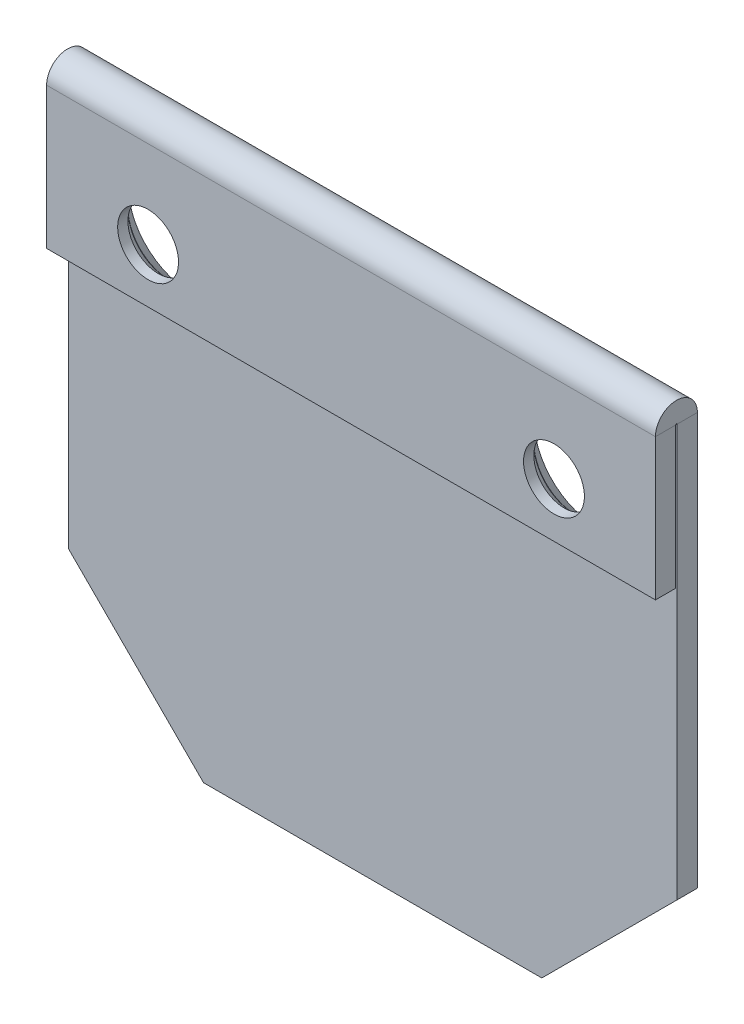
ISO-10303-21;
HEADER;
FILE_DESCRIPTION(('STEP AP214'),'2;1');
FILE_NAME('part.step','',(''),(''),'','','');
FILE_SCHEMA(('AUTOMOTIVE_DESIGN { 1 0 10303 214 1 1 1 1 }'));
ENDSEC;
DATA;
#1=APPLICATION_CONTEXT('core data for automotive mechanical design processes');
#2=APPLICATION_PROTOCOL_DEFINITION('international standard','automotive_design',2000,#1);
#3=PRODUCT_CONTEXT('',#1,'mechanical');
#4=PRODUCT('Part','Part','',(#3));
#5=PRODUCT_RELATED_PRODUCT_CATEGORY('part','',(#4));
#6=PRODUCT_DEFINITION_FORMATION('','',#4);
#7=PRODUCT_DEFINITION_CONTEXT('part definition',#1,'design');
#8=PRODUCT_DEFINITION('design','',#6,#7);
#9=PRODUCT_DEFINITION_SHAPE('','',#8);
#10=(LENGTH_UNIT() NAMED_UNIT(*) SI_UNIT(.MILLI.,.METRE.));
#11=(NAMED_UNIT(*) PLANE_ANGLE_UNIT() SI_UNIT($,.RADIAN.));
#12=(NAMED_UNIT(*) SI_UNIT($,.STERADIAN.) SOLID_ANGLE_UNIT());
#13=UNCERTAINTY_MEASURE_WITH_UNIT(LENGTH_MEASURE(1.E-05),#10,'distance_accuracy_value','');
#14=(GEOMETRIC_REPRESENTATION_CONTEXT(3) GLOBAL_UNCERTAINTY_ASSIGNED_CONTEXT((#13)) GLOBAL_UNIT_ASSIGNED_CONTEXT((#10,
#11,#12)) REPRESENTATION_CONTEXT('',''));
#15=CARTESIAN_POINT('',(0.,0.,0.));
#16=DIRECTION('',(0.,0.,1.));
#17=DIRECTION('',(1.,0.,0.));
#18=AXIS2_PLACEMENT_3D('',#15,#16,#17);
#19=CARTESIAN_POINT('',(-22.5,-21.,-1.5));
#20=DIRECTION('',(-1.,0.,0.));
#21=DIRECTION('',(0.,0.,1.));
#22=AXIS2_PLACEMENT_3D('',#19,#20,#21);
#23=PLANE('',#22);
#24=DIRECTION('',(0.,-1.,0.));
#25=VECTOR('',#24,1.);
#26=CARTESIAN_POINT('',(-22.5,-21.,-1.5));
#27=LINE('',#26,#25);
#28=CARTESIAN_POINT('',(-22.5,19.45,-1.5));
#29=VERTEX_POINT('',#28);
#30=CARTESIAN_POINT('',(-22.5,-11.,-1.5));
#31=VERTEX_POINT('',#30);
#32=EDGE_CURVE('E122',#29,#31,#27,.T.);
#33=ORIENTED_EDGE('',*,*,#32,.T.);
#34=DIRECTION('',(0.,0.,1.));
#35=VECTOR('',#34,1.);
#36=CARTESIAN_POINT('',(-22.5,-11.,-1.5));
#37=LINE('',#36,#35);
#38=CARTESIAN_POINT('',(-22.5,-11.,0.));
#39=VERTEX_POINT('',#38);
#40=EDGE_CURVE('E218',#31,#39,#37,.T.);
#41=ORIENTED_EDGE('',*,*,#40,.T.);
#42=DIRECTION('',(0.,-1.,0.));
#43=VECTOR('',#42,1.);
#44=CARTESIAN_POINT('',(-22.5,-21.,0.));
#45=LINE('',#44,#43);
#46=CARTESIAN_POINT('',(-22.5,19.45,0.));
#47=VERTEX_POINT('',#46);
#48=EDGE_CURVE('E199',#47,#39,#45,.T.);
#49=ORIENTED_EDGE('',*,*,#48,.F.);
#50=DIRECTION('',(0.,0.,-1.));
#51=VECTOR('',#50,1.);
#52=CARTESIAN_POINT('',(-22.5,19.45,0.));
#53=LINE('',#52,#51);
#54=EDGE_CURVE('E135',#47,#29,#53,.T.);
#55=ORIENTED_EDGE('',*,*,#54,.T.);
#56=EDGE_LOOP('',(#33,#41,#49,#55));
#57=FACE_BOUND('',#56,.T.);
#58=ADVANCED_FACE('F36',(#57),#23,.T.);
#59=CARTESIAN_POINT('',(22.5,-21.,-1.5));
#60=DIRECTION('',(1.,0.,0.));
#61=DIRECTION('',(0.,0.,-1.));
#62=AXIS2_PLACEMENT_3D('',#59,#60,#61);
#63=PLANE('',#62);
#64=DIRECTION('',(0.,1.,0.));
#65=VECTOR('',#64,1.);
#66=CARTESIAN_POINT('',(22.5,-21.,0.));
#67=LINE('',#66,#65);
#68=CARTESIAN_POINT('',(22.5,-11.,0.));
#69=VERTEX_POINT('',#68);
#70=CARTESIAN_POINT('',(22.5,19.45,0.));
#71=VERTEX_POINT('',#70);
#72=EDGE_CURVE('E192',#69,#71,#67,.T.);
#73=ORIENTED_EDGE('',*,*,#72,.F.);
#74=DIRECTION('',(0.,0.,-1.));
#75=VECTOR('',#74,1.);
#76=CARTESIAN_POINT('',(22.5,-11.,-1.5));
#77=LINE('',#76,#75);
#78=CARTESIAN_POINT('',(22.5,-11.,-1.5));
#79=VERTEX_POINT('',#78);
#80=EDGE_CURVE('E117',#69,#79,#77,.T.);
#81=ORIENTED_EDGE('',*,*,#80,.T.);
#82=DIRECTION('',(0.,1.,0.));
#83=VECTOR('',#82,1.);
#84=CARTESIAN_POINT('',(22.5,-21.,-1.5));
#85=LINE('',#84,#83);
#86=CARTESIAN_POINT('',(22.5,19.45,-1.5));
#87=VERTEX_POINT('',#86);
#88=EDGE_CURVE('E111',#79,#87,#85,.T.);
#89=ORIENTED_EDGE('',*,*,#88,.T.);
#90=DIRECTION('',(0.,0.,-1.));
#91=VECTOR('',#90,1.);
#92=CARTESIAN_POINT('',(22.5,19.45,0.));
#93=LINE('',#92,#91);
#94=EDGE_CURVE('E115',#71,#87,#93,.T.);
#95=ORIENTED_EDGE('',*,*,#94,.F.);
#96=EDGE_LOOP('',(#73,#81,#89,#95));
#97=FACE_BOUND('',#96,.T.);
#98=ADVANCED_FACE('F114',(#97),#63,.T.);
#99=CARTESIAN_POINT('',(-22.5,-21.,-1.5));
#100=DIRECTION('',(0.,-1.,0.));
#101=DIRECTION('',(0.,0.,-1.));
#102=AXIS2_PLACEMENT_3D('',#99,#100,#101);
#103=PLANE('',#102);
#104=DIRECTION('',(1.,0.,0.));
#105=VECTOR('',#104,1.);
#106=CARTESIAN_POINT('',(-22.5,-21.,0.));
#107=LINE('',#106,#105);
#108=CARTESIAN_POINT('',(-12.5,-21.,0.));
#109=VERTEX_POINT('',#108);
#110=CARTESIAN_POINT('',(12.5,-21.,0.));
#111=VERTEX_POINT('',#110);
#112=EDGE_CURVE('E123',#109,#111,#107,.T.);
#113=ORIENTED_EDGE('',*,*,#112,.F.);
#114=DIRECTION('',(0.,0.,-1.));
#115=VECTOR('',#114,1.);
#116=CARTESIAN_POINT('',(-12.5,-21.,-1.5));
#117=LINE('',#116,#115);
#118=CARTESIAN_POINT('',(-12.5,-21.,-1.5));
#119=VERTEX_POINT('',#118);
#120=EDGE_CURVE('E44',#109,#119,#117,.T.);
#121=ORIENTED_EDGE('',*,*,#120,.T.);
#122=DIRECTION('',(1.,0.,0.));
#123=VECTOR('',#122,1.);
#124=CARTESIAN_POINT('',(-22.5,-21.,-1.5));
#125=LINE('',#124,#123);
#126=CARTESIAN_POINT('',(12.5,-21.,-1.5));
#127=VERTEX_POINT('',#126);
#128=EDGE_CURVE('E195',#119,#127,#125,.T.);
#129=ORIENTED_EDGE('',*,*,#128,.T.);
#130=DIRECTION('',(0.,0.,1.));
#131=VECTOR('',#130,1.);
#132=CARTESIAN_POINT('',(12.5,-21.,-1.5));
#133=LINE('',#132,#131);
#134=EDGE_CURVE('E197',#127,#111,#133,.T.);
#135=ORIENTED_EDGE('',*,*,#134,.T.);
#136=EDGE_LOOP('',(#113,#121,#129,#135));
#137=FACE_BOUND('',#136,.T.);
#138=ADVANCED_FACE('F266',(#137),#103,.T.);
#139=CARTESIAN_POINT('',(0.,0.,-1.5));
#140=DIRECTION('',(0.,0.,-1.));
#141=DIRECTION('',(-1.,0.,0.));
#142=AXIS2_PLACEMENT_3D('',#139,#140,#141);
#143=PLANE('',#142);
#144=CARTESIAN_POINT('',(15.,13.,-1.5));
#145=DIRECTION('',(0.,0.,-1.));
#146=DIRECTION('',(-1.,0.,0.));
#147=AXIS2_PLACEMENT_3D('',#144,#145,#146);
#148=CIRCLE('',#147,4.59);
#149=CARTESIAN_POINT('',(10.41,13.,-1.5));
#150=VERTEX_POINT('',#149);
#151=EDGE_CURVE('E296',#150,#150,#148,.T.);
#152=ORIENTED_EDGE('',*,*,#151,.F.);
#153=EDGE_LOOP('',(#152));
#154=FACE_BOUND('',#153,.T.);
#155=CARTESIAN_POINT('',(-15.,13.,-1.5));
#156=DIRECTION('',(0.,0.,-1.));
#157=DIRECTION('',(-1.,0.,0.));
#158=AXIS2_PLACEMENT_3D('',#155,#156,#157);
#159=CIRCLE('',#158,4.59);
#160=CARTESIAN_POINT('',(-19.59,13.,-1.5));
#161=VERTEX_POINT('',#160);
#162=EDGE_CURVE('E299',#161,#161,#159,.T.);
#163=ORIENTED_EDGE('',*,*,#162,.F.);
#164=EDGE_LOOP('',(#163));
#165=FACE_BOUND('',#164,.T.);
#166=ORIENTED_EDGE('',*,*,#128,.F.);
#167=DIRECTION('',(0.707106781186548,-0.707106781186548,0.));
#168=VECTOR('',#167,1.);
#169=CARTESIAN_POINT('',(-16.75,-16.75,-1.5));
#170=LINE('',#169,#168);
#171=EDGE_CURVE('E11',#119,#31,#170,.F.);
#172=ORIENTED_EDGE('',*,*,#171,.T.);
#173=ORIENTED_EDGE('',*,*,#32,.F.);
#174=DIRECTION('',(-1.,0.,0.));
#175=VECTOR('',#174,1.);
#176=CARTESIAN_POINT('',(-22.5,19.45,-1.5));
#177=LINE('',#176,#175);
#178=EDGE_CURVE('E141',#29,#87,#177,.F.);
#179=ORIENTED_EDGE('',*,*,#178,.T.);
#180=ORIENTED_EDGE('',*,*,#88,.F.);
#181=DIRECTION('',(0.707106781186548,0.707106781186547,0.));
#182=VECTOR('',#181,1.);
#183=CARTESIAN_POINT('',(16.75,-16.75,-1.5));
#184=LINE('',#183,#182);
#185=EDGE_CURVE('E216',#79,#127,#184,.F.);
#186=ORIENTED_EDGE('',*,*,#185,.T.);
#187=EDGE_LOOP('',(#166,#172,#173,#179,#180,#186));
#188=FACE_BOUND('',#187,.T.);
#189=ADVANCED_FACE('F146',(#154,#165,#188),#143,.T.);
#190=CARTESIAN_POINT('',(0.,0.,0.));
#191=DIRECTION('',(0.,0.,-1.));
#192=DIRECTION('',(-1.,0.,0.));
#193=AXIS2_PLACEMENT_3D('',#190,#191,#192);
#194=PLANE('',#193);
#195=CARTESIAN_POINT('',(15.,13.,0.));
#196=DIRECTION('',(0.,0.,-1.));
#197=DIRECTION('',(-1.,0.,0.));
#198=AXIS2_PLACEMENT_3D('',#195,#196,#197);
#199=CIRCLE('',#198,3.08999999999999);
#200=CARTESIAN_POINT('',(11.91,13.,0.));
#201=VERTEX_POINT('',#200);
#202=EDGE_CURVE('E209',#201,#201,#199,.T.);
#203=ORIENTED_EDGE('',*,*,#202,.T.);
#204=EDGE_LOOP('',(#203));
#205=FACE_BOUND('',#204,.T.);
#206=CARTESIAN_POINT('',(-15.,13.,0.));
#207=DIRECTION('',(0.,0.,-1.));
#208=DIRECTION('',(-1.,0.,0.));
#209=AXIS2_PLACEMENT_3D('',#206,#207,#208);
#210=CIRCLE('',#209,3.08999999999999);
#211=CARTESIAN_POINT('',(-18.09,13.,0.));
#212=VERTEX_POINT('',#211);
#213=EDGE_CURVE('E152',#212,#212,#210,.T.);
#214=ORIENTED_EDGE('',*,*,#213,.T.);
#215=EDGE_LOOP('',(#214));
#216=FACE_BOUND('',#215,.T.);
#217=ORIENTED_EDGE('',*,*,#48,.T.);
#218=DIRECTION('',(-0.707106781186548,0.707106781186548,0.));
#219=VECTOR('',#218,1.);
#220=CARTESIAN_POINT('',(-22.5,-11.,0.));
#221=LINE('',#220,#219);
#222=EDGE_CURVE('E58',#39,#109,#221,.F.);
#223=ORIENTED_EDGE('',*,*,#222,.T.);
#224=ORIENTED_EDGE('',*,*,#112,.T.);
#225=DIRECTION('',(-0.707106781186548,-0.707106781186547,0.));
#226=VECTOR('',#225,1.);
#227=CARTESIAN_POINT('',(12.5,-21.,0.));
#228=LINE('',#227,#226);
#229=EDGE_CURVE('E213',#111,#69,#228,.F.);
#230=ORIENTED_EDGE('',*,*,#229,.T.);
#231=ORIENTED_EDGE('',*,*,#72,.T.);
#232=DIRECTION('',(-1.,0.,0.));
#233=VECTOR('',#232,1.);
#234=CARTESIAN_POINT('',(-22.5,19.45,0.));
#235=LINE('',#234,#233);
#236=EDGE_CURVE('E156',#47,#71,#235,.F.);
#237=ORIENTED_EDGE('',*,*,#236,.F.);
#238=EDGE_LOOP('',(#217,#223,#224,#230,#231,#237));
#239=FACE_BOUND('',#238,.T.);
#240=ADVANCED_FACE('F227',(#205,#216,#239),#194,.F.);
#241=CARTESIAN_POINT('',(-22.5,14.225,1.6));
#242=DIRECTION('',(1.,0.,0.));
#243=DIRECTION('',(0.,1.,0.));
#244=AXIS2_PLACEMENT_3D('',#241,#242,#243);
#245=PLANE('',#244);
#246=DIRECTION('',(0.,0.,1.));
#247=VECTOR('',#246,1.);
#248=CARTESIAN_POINT('',(-22.5,19.45,1.6));
#249=LINE('',#248,#247);
#250=CARTESIAN_POINT('',(-22.5,19.45,0.1));
#251=VERTEX_POINT('',#250);
#252=CARTESIAN_POINT('',(-22.5,19.45,1.6));
#253=VERTEX_POINT('',#252);
#254=EDGE_CURVE('E186',#251,#253,#249,.T.);
#255=ORIENTED_EDGE('',*,*,#254,.F.);
#256=DIRECTION('',(0.,1.,0.));
#257=VECTOR('',#256,1.);
#258=CARTESIAN_POINT('',(-22.5,14.225,0.1));
#259=LINE('',#258,#257);
#260=CARTESIAN_POINT('',(-22.5,9.,0.1));
#261=VERTEX_POINT('',#260);
#262=EDGE_CURVE('E177',#261,#251,#259,.T.);
#263=ORIENTED_EDGE('',*,*,#262,.F.);
#264=DIRECTION('',(0.,0.,1.));
#265=VECTOR('',#264,1.);
#266=CARTESIAN_POINT('',(-22.5,9.,1.6));
#267=LINE('',#266,#265);
#268=CARTESIAN_POINT('',(-22.5,9.,1.6));
#269=VERTEX_POINT('',#268);
#270=EDGE_CURVE('E184',#261,#269,#267,.T.);
#271=ORIENTED_EDGE('',*,*,#270,.T.);
#272=DIRECTION('',(0.,1.,0.));
#273=VECTOR('',#272,1.);
#274=CARTESIAN_POINT('',(-22.5,14.225,1.6));
#275=LINE('',#274,#273);
#276=EDGE_CURVE('E167',#269,#253,#275,.T.);
#277=ORIENTED_EDGE('',*,*,#276,.T.);
#278=EDGE_LOOP('',(#255,#263,#271,#277));
#279=FACE_BOUND('',#278,.T.);
#280=ADVANCED_FACE('F237',(#279),#245,.F.);
#281=CARTESIAN_POINT('',(0.,9.,1.6));
#282=DIRECTION('',(0.,1.,0.));
#283=DIRECTION('',(-1.,0.,0.));
#284=AXIS2_PLACEMENT_3D('',#281,#282,#283);
#285=PLANE('',#284);
#286=ORIENTED_EDGE('',*,*,#270,.F.);
#287=DIRECTION('',(1.,0.,0.));
#288=VECTOR('',#287,1.);
#289=CARTESIAN_POINT('',(0.,9.,0.1));
#290=LINE('',#289,#288);
#291=CARTESIAN_POINT('',(22.5,9.,0.1));
#292=VERTEX_POINT('',#291);
#293=EDGE_CURVE('E174',#292,#261,#290,.F.);
#294=ORIENTED_EDGE('',*,*,#293,.F.);
#295=DIRECTION('',(0.,0.,1.));
#296=VECTOR('',#295,1.);
#297=CARTESIAN_POINT('',(22.5,9.,1.6));
#298=LINE('',#297,#296);
#299=CARTESIAN_POINT('',(22.5,9.,1.6));
#300=VERTEX_POINT('',#299);
#301=EDGE_CURVE('E166',#292,#300,#298,.T.);
#302=ORIENTED_EDGE('',*,*,#301,.T.);
#303=DIRECTION('',(-1.,0.,0.));
#304=VECTOR('',#303,1.);
#305=CARTESIAN_POINT('',(0.,9.,1.6));
#306=LINE('',#305,#304);
#307=EDGE_CURVE('E163',#300,#269,#306,.T.);
#308=ORIENTED_EDGE('',*,*,#307,.T.);
#309=EDGE_LOOP('',(#286,#294,#302,#308));
#310=FACE_BOUND('',#309,.T.);
#311=ADVANCED_FACE('F244',(#310),#285,.F.);
#312=CARTESIAN_POINT('',(22.5,14.225,1.6));
#313=DIRECTION('',(-1.,0.,0.));
#314=DIRECTION('',(0.,-1.,0.));
#315=AXIS2_PLACEMENT_3D('',#312,#313,#314);
#316=PLANE('',#315);
#317=DIRECTION('',(0.,1.,0.));
#318=VECTOR('',#317,1.);
#319=CARTESIAN_POINT('',(22.5,14.225,0.1));
#320=LINE('',#319,#318);
#321=CARTESIAN_POINT('',(22.5,19.45,0.1));
#322=VERTEX_POINT('',#321);
#323=EDGE_CURVE('E134',#322,#292,#320,.F.);
#324=ORIENTED_EDGE('',*,*,#323,.F.);
#325=DIRECTION('',(0.,0.,1.));
#326=VECTOR('',#325,1.);
#327=CARTESIAN_POINT('',(22.5,19.45,1.6));
#328=LINE('',#327,#326);
#329=CARTESIAN_POINT('',(22.5,19.45,1.6));
#330=VERTEX_POINT('',#329);
#331=EDGE_CURVE('E189',#322,#330,#328,.T.);
#332=ORIENTED_EDGE('',*,*,#331,.T.);
#333=DIRECTION('',(0.,-1.,0.));
#334=VECTOR('',#333,1.);
#335=CARTESIAN_POINT('',(22.5,14.225,1.6));
#336=LINE('',#335,#334);
#337=EDGE_CURVE('E171',#330,#300,#336,.T.);
#338=ORIENTED_EDGE('',*,*,#337,.T.);
#339=ORIENTED_EDGE('',*,*,#301,.F.);
#340=EDGE_LOOP('',(#324,#332,#338,#339));
#341=FACE_BOUND('',#340,.T.);
#342=ADVANCED_FACE('F249',(#341),#316,.F.);
#343=CARTESIAN_POINT('',(0.,14.225,1.6));
#344=DIRECTION('',(0.,0.,1.));
#345=DIRECTION('',(1.,0.,0.));
#346=AXIS2_PLACEMENT_3D('',#343,#344,#345);
#347=PLANE('',#346);
#348=CARTESIAN_POINT('',(15.,13.,1.6));
#349=DIRECTION('',(0.,0.,-1.));
#350=DIRECTION('',(-1.,0.,0.));
#351=AXIS2_PLACEMENT_3D('',#348,#349,#350);
#352=CIRCLE('',#351,2.25);
#353=CARTESIAN_POINT('',(12.75,13.,1.6));
#354=VERTEX_POINT('',#353);
#355=EDGE_CURVE('E210',#354,#354,#352,.T.);
#356=ORIENTED_EDGE('',*,*,#355,.T.);
#357=EDGE_LOOP('',(#356));
#358=FACE_BOUND('',#357,.T.);
#359=CARTESIAN_POINT('',(-15.,13.,1.6));
#360=DIRECTION('',(0.,0.,-1.));
#361=DIRECTION('',(-1.,0.,0.));
#362=AXIS2_PLACEMENT_3D('',#359,#360,#361);
#363=CIRCLE('',#362,2.25);
#364=CARTESIAN_POINT('',(-17.25,13.,1.6));
#365=VERTEX_POINT('',#364);
#366=EDGE_CURVE('E205',#365,#365,#363,.T.);
#367=ORIENTED_EDGE('',*,*,#366,.T.);
#368=EDGE_LOOP('',(#367));
#369=FACE_BOUND('',#368,.T.);
#370=ORIENTED_EDGE('',*,*,#307,.F.);
#371=ORIENTED_EDGE('',*,*,#337,.F.);
#372=DIRECTION('',(1.,0.,0.));
#373=VECTOR('',#372,1.);
#374=CARTESIAN_POINT('',(0.,19.45,1.6));
#375=LINE('',#374,#373);
#376=EDGE_CURVE('E143',#253,#330,#375,.T.);
#377=ORIENTED_EDGE('',*,*,#376,.F.);
#378=ORIENTED_EDGE('',*,*,#276,.F.);
#379=EDGE_LOOP('',(#370,#371,#377,#378));
#380=FACE_BOUND('',#379,.T.);
#381=ADVANCED_FACE('F247',(#358,#369,#380),#347,.T.);
#382=CARTESIAN_POINT('',(0.,14.225,0.1));
#383=DIRECTION('',(0.,0.,1.));
#384=DIRECTION('',(1.,0.,0.));
#385=AXIS2_PLACEMENT_3D('',#382,#383,#384);
#386=PLANE('',#385);
#387=CARTESIAN_POINT('',(15.,13.,0.0999999999999998));
#388=DIRECTION('',(0.,0.,1.));
#389=DIRECTION('',(1.,0.,0.));
#390=AXIS2_PLACEMENT_3D('',#387,#388,#389);
#391=CIRCLE('',#390,2.98999999999999);
#392=CARTESIAN_POINT('',(17.99,13.,0.0999999999999998));
#393=VERTEX_POINT('',#392);
#394=EDGE_CURVE('E206',#393,#393,#391,.T.);
#395=ORIENTED_EDGE('',*,*,#394,.T.);
#396=EDGE_LOOP('',(#395));
#397=FACE_BOUND('',#396,.T.);
#398=CARTESIAN_POINT('',(-15.,13.,0.0999999999999998));
#399=DIRECTION('',(0.,0.,1.));
#400=DIRECTION('',(1.,0.,0.));
#401=AXIS2_PLACEMENT_3D('',#398,#399,#400);
#402=CIRCLE('',#401,2.98999999999999);
#403=CARTESIAN_POINT('',(-12.01,13.,0.0999999999999998));
#404=VERTEX_POINT('',#403);
#405=EDGE_CURVE('E202',#404,#404,#402,.T.);
#406=ORIENTED_EDGE('',*,*,#405,.T.);
#407=EDGE_LOOP('',(#406));
#408=FACE_BOUND('',#407,.T.);
#409=ORIENTED_EDGE('',*,*,#293,.T.);
#410=ORIENTED_EDGE('',*,*,#262,.T.);
#411=DIRECTION('',(1.,0.,0.));
#412=VECTOR('',#411,1.);
#413=CARTESIAN_POINT('',(0.,19.45,0.1));
#414=LINE('',#413,#412);
#415=EDGE_CURVE('E180',#251,#322,#414,.T.);
#416=ORIENTED_EDGE('',*,*,#415,.T.);
#417=ORIENTED_EDGE('',*,*,#323,.T.);
#418=EDGE_LOOP('',(#409,#410,#416,#417));
#419=FACE_BOUND('',#418,.T.);
#420=ADVANCED_FACE('F240',(#397,#408,#419),#386,.F.);
#421=CARTESIAN_POINT('',(22.5,19.45,0.0500000000000001));
#422=DIRECTION('',(1.,0.,0.));
#423=DIRECTION('',(0.,0.,-1.));
#424=AXIS2_PLACEMENT_3D('',#421,#422,#423);
#425=PLANE('',#424);
#426=ORIENTED_EDGE('',*,*,#331,.F.);
#427=CARTESIAN_POINT('',(22.5,19.45,0.0500000000000001));
#428=DIRECTION('',(-1.,0.,0.));
#429=DIRECTION('',(0.,0.,1.));
#430=AXIS2_PLACEMENT_3D('',#427,#428,#429);
#431=CIRCLE('',#430,0.0500000000000001);
#432=EDGE_CURVE('E133',#71,#322,#431,.F.);
#433=ORIENTED_EDGE('',*,*,#432,.F.);
#434=ORIENTED_EDGE('',*,*,#94,.T.);
#435=CARTESIAN_POINT('',(22.5,19.45,0.0500000000000001));
#436=DIRECTION('',(-1.,0.,0.));
#437=DIRECTION('',(0.,0.,1.));
#438=AXIS2_PLACEMENT_3D('',#435,#436,#437);
#439=CIRCLE('',#438,1.55);
#440=EDGE_CURVE('E131',#87,#330,#439,.F.);
#441=ORIENTED_EDGE('',*,*,#440,.T.);
#442=EDGE_LOOP('',(#426,#433,#434,#441));
#443=FACE_BOUND('',#442,.T.);
#444=ADVANCED_FACE('F130',(#443),#425,.T.);
#445=CARTESIAN_POINT('',(-22.5,19.45,0.0500000000000001));
#446=DIRECTION('',(1.,0.,0.));
#447=DIRECTION('',(0.,0.,-1.));
#448=AXIS2_PLACEMENT_3D('',#445,#446,#447);
#449=PLANE('',#448);
#450=CARTESIAN_POINT('',(-22.5,19.45,0.0500000000000001));
#451=DIRECTION('',(-1.,0.,0.));
#452=DIRECTION('',(0.,0.,1.));
#453=AXIS2_PLACEMENT_3D('',#450,#451,#452);
#454=CIRCLE('',#453,0.0500000000000001);
#455=EDGE_CURVE('E159',#251,#47,#454,.T.);
#456=ORIENTED_EDGE('',*,*,#455,.F.);
#457=ORIENTED_EDGE('',*,*,#254,.T.);
#458=CARTESIAN_POINT('',(-22.5,19.45,0.0500000000000001));
#459=DIRECTION('',(-1.,0.,0.));
#460=DIRECTION('',(0.,0.,1.));
#461=AXIS2_PLACEMENT_3D('',#458,#459,#460);
#462=CIRCLE('',#461,1.55);
#463=EDGE_CURVE('E148',#253,#29,#462,.T.);
#464=ORIENTED_EDGE('',*,*,#463,.T.);
#465=ORIENTED_EDGE('',*,*,#54,.F.);
#466=EDGE_LOOP('',(#456,#457,#464,#465));
#467=FACE_BOUND('',#466,.T.);
#468=ADVANCED_FACE('F234',(#467),#449,.F.);
#469=CARTESIAN_POINT('',(-22.5,19.45,0.0500000000000001));
#470=DIRECTION('',(-1.,0.,0.));
#471=DIRECTION('',(0.,0.,1.));
#472=AXIS2_PLACEMENT_3D('',#469,#470,#471);
#473=CYLINDRICAL_SURFACE('',#472,1.55);
#474=ORIENTED_EDGE('',*,*,#178,.F.);
#475=ORIENTED_EDGE('',*,*,#463,.F.);
#476=ORIENTED_EDGE('',*,*,#376,.T.);
#477=ORIENTED_EDGE('',*,*,#440,.F.);
#478=EDGE_LOOP('',(#474,#475,#476,#477));
#479=FACE_BOUND('',#478,.T.);
#480=ADVANCED_FACE('F139',(#479),#473,.T.);
#481=CARTESIAN_POINT('',(-22.5,19.45,0.0500000000000001));
#482=DIRECTION('',(-1.,0.,0.));
#483=DIRECTION('',(0.,0.,1.));
#484=AXIS2_PLACEMENT_3D('',#481,#482,#483);
#485=CYLINDRICAL_SURFACE('',#484,0.0500000000000001);
#486=ORIENTED_EDGE('',*,*,#236,.T.);
#487=ORIENTED_EDGE('',*,*,#432,.T.);
#488=ORIENTED_EDGE('',*,*,#415,.F.);
#489=ORIENTED_EDGE('',*,*,#455,.T.);
#490=EDGE_LOOP('',(#486,#487,#488,#489));
#491=FACE_BOUND('',#490,.T.);
#492=ADVANCED_FACE('F229',(#491),#485,.F.);
#493=CARTESIAN_POINT('',(-15.,13.,-1.5));
#494=DIRECTION('',(0.,0.,-1.));
#495=DIRECTION('',(-1.,0.,0.));
#496=AXIS2_PLACEMENT_3D('',#493,#494,#495);
#497=CYLINDRICAL_SURFACE('',#496,2.24999999999999);
#498=ORIENTED_EDGE('',*,*,#366,.F.);
#499=EDGE_LOOP('',(#498));
#500=FACE_BOUND('',#499,.T.);
#501=CARTESIAN_POINT('',(-15.,13.,0.839999999999995));
#502=DIRECTION('',(0.,0.,-1.));
#503=DIRECTION('',(-1.,0.,0.));
#504=AXIS2_PLACEMENT_3D('',#501,#502,#503);
#505=CIRCLE('',#504,2.24999999999999);
#506=CARTESIAN_POINT('',(-17.25,13.,0.839999999999995));
#507=VERTEX_POINT('',#506);
#508=EDGE_CURVE('E301',#507,#507,#505,.T.);
#509=ORIENTED_EDGE('',*,*,#508,.T.);
#510=EDGE_LOOP('',(#509));
#511=FACE_BOUND('',#510,.T.);
#512=ADVANCED_FACE('F312',(#500,#511),#497,.F.);
#513=CARTESIAN_POINT('',(-15.,13.,-1.5));
#514=DIRECTION('',(0.,0.,-1.));
#515=DIRECTION('',(-1.,0.,0.));
#516=AXIS2_PLACEMENT_3D('',#513,#514,#515);
#517=CONICAL_SURFACE('',#516,4.59,0.785398163397452);
#518=ORIENTED_EDGE('',*,*,#508,.F.);
#519=EDGE_LOOP('',(#518));
#520=FACE_BOUND('',#519,.T.);
#521=ORIENTED_EDGE('',*,*,#405,.F.);
#522=EDGE_LOOP('',(#521));
#523=FACE_BOUND('',#522,.T.);
#524=ADVANCED_FACE('F315',(#520,#523),#517,.F.);
#525=ORIENTED_EDGE('',*,*,#162,.T.);
#526=EDGE_LOOP('',(#525));
#527=FACE_BOUND('',#526,.T.);
#528=ORIENTED_EDGE('',*,*,#213,.F.);
#529=EDGE_LOOP('',(#528));
#530=FACE_BOUND('',#529,.T.);
#531=ADVANCED_FACE('F321',(#527,#530),#517,.F.);
#532=CARTESIAN_POINT('',(15.,13.,-1.5));
#533=DIRECTION('',(0.,0.,-1.));
#534=DIRECTION('',(-1.,0.,0.));
#535=AXIS2_PLACEMENT_3D('',#532,#533,#534);
#536=CONICAL_SURFACE('',#535,4.59,0.785398163397451);
#537=CARTESIAN_POINT('',(15.,13.,0.839999999999995));
#538=DIRECTION('',(0.,0.,-1.));
#539=DIRECTION('',(-1.,0.,0.));
#540=AXIS2_PLACEMENT_3D('',#537,#538,#539);
#541=CIRCLE('',#540,2.24999999999999);
#542=CARTESIAN_POINT('',(12.75,13.,0.839999999999995));
#543=VERTEX_POINT('',#542);
#544=EDGE_CURVE('E502',#543,#543,#541,.T.);
#545=ORIENTED_EDGE('',*,*,#544,.F.);
#546=EDGE_LOOP('',(#545));
#547=FACE_BOUND('',#546,.T.);
#548=ORIENTED_EDGE('',*,*,#394,.F.);
#549=EDGE_LOOP('',(#548));
#550=FACE_BOUND('',#549,.T.);
#551=ADVANCED_FACE('F281',(#547,#550),#536,.F.);
#552=CARTESIAN_POINT('',(15.,13.,-1.5));
#553=DIRECTION('',(0.,0.,-1.));
#554=DIRECTION('',(-1.,0.,0.));
#555=AXIS2_PLACEMENT_3D('',#552,#553,#554);
#556=CYLINDRICAL_SURFACE('',#555,2.25);
#557=ORIENTED_EDGE('',*,*,#355,.F.);
#558=EDGE_LOOP('',(#557));
#559=FACE_BOUND('',#558,.T.);
#560=ORIENTED_EDGE('',*,*,#544,.T.);
#561=EDGE_LOOP('',(#560));
#562=FACE_BOUND('',#561,.T.);
#563=ADVANCED_FACE('F278',(#559,#562),#556,.F.);
#564=ORIENTED_EDGE('',*,*,#151,.T.);
#565=EDGE_LOOP('',(#564));
#566=FACE_BOUND('',#565,.T.);
#567=ORIENTED_EDGE('',*,*,#202,.F.);
#568=EDGE_LOOP('',(#567));
#569=FACE_BOUND('',#568,.T.);
#570=ADVANCED_FACE('F272',(#566,#569),#536,.F.);
#571=CARTESIAN_POINT('',(12.5,-21.,-1.5));
#572=DIRECTION('',(-0.707106781186547,0.707106781186548,0.));
#573=DIRECTION('',(0.,0.,1.));
#574=AXIS2_PLACEMENT_3D('',#571,#572,#573);
#575=PLANE('',#574);
#576=ORIENTED_EDGE('',*,*,#185,.F.);
#577=ORIENTED_EDGE('',*,*,#80,.F.);
#578=ORIENTED_EDGE('',*,*,#229,.F.);
#579=ORIENTED_EDGE('',*,*,#134,.F.);
#580=EDGE_LOOP('',(#576,#577,#578,#579));
#581=FACE_BOUND('',#580,.T.);
#582=ADVANCED_FACE('F270',(#581),#575,.F.);
#583=CARTESIAN_POINT('',(-22.5,-11.,-1.5));
#584=DIRECTION('',(0.707106781186548,0.707106781186548,0.));
#585=DIRECTION('',(0.,0.,1.));
#586=AXIS2_PLACEMENT_3D('',#583,#584,#585);
#587=PLANE('',#586);
#588=ORIENTED_EDGE('',*,*,#171,.F.);
#589=ORIENTED_EDGE('',*,*,#120,.F.);
#590=ORIENTED_EDGE('',*,*,#222,.F.);
#591=ORIENTED_EDGE('',*,*,#40,.F.);
#592=EDGE_LOOP('',(#588,#589,#590,#591));
#593=FACE_BOUND('',#592,.T.);
#594=ADVANCED_FACE('F38',(#593),#587,.F.);
#595=CLOSED_SHELL('',(#58,#98,#138,#189,#240,#280,#311,#342,#381,#420,#444,#468,#480,#492,#512,
#524,#531,#551,#563,#570,#582,#594));
#596=MANIFOLD_SOLID_BREP('B2',#595);
#597=ADVANCED_BREP_SHAPE_REPRESENTATION('',(#18,#596),#14);
#598=SHAPE_DEFINITION_REPRESENTATION(#9,#597);
ENDSEC;
END-ISO-10303-21;
